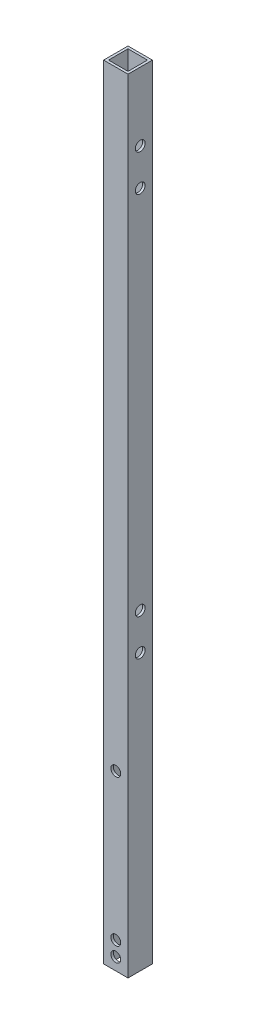
ISO-10303-21;
HEADER;
FILE_DESCRIPTION(('STEP AP214'),'2;1');
FILE_NAME('part.step','',(''),(''),'','','');
FILE_SCHEMA(('AUTOMOTIVE_DESIGN { 1 0 10303 214 1 1 1 1 }'));
ENDSEC;
DATA;
#1=APPLICATION_CONTEXT('core data for automotive mechanical design processes');
#2=APPLICATION_PROTOCOL_DEFINITION('international standard','automotive_design',2000,#1);
#3=PRODUCT_CONTEXT('',#1,'mechanical');
#4=PRODUCT('Part','Part','',(#3));
#5=PRODUCT_RELATED_PRODUCT_CATEGORY('part','',(#4));
#6=PRODUCT_DEFINITION_FORMATION('','',#4);
#7=PRODUCT_DEFINITION_CONTEXT('part definition',#1,'design');
#8=PRODUCT_DEFINITION('design','',#6,#7);
#9=PRODUCT_DEFINITION_SHAPE('','',#8);
#10=(LENGTH_UNIT() NAMED_UNIT(*) SI_UNIT(.MILLI.,.METRE.));
#11=(NAMED_UNIT(*) PLANE_ANGLE_UNIT() SI_UNIT($,.RADIAN.));
#12=(NAMED_UNIT(*) SI_UNIT($,.STERADIAN.) SOLID_ANGLE_UNIT());
#13=UNCERTAINTY_MEASURE_WITH_UNIT(LENGTH_MEASURE(1.E-05),#10,'distance_accuracy_value','');
#14=(GEOMETRIC_REPRESENTATION_CONTEXT(3) GLOBAL_UNCERTAINTY_ASSIGNED_CONTEXT((#13)) GLOBAL_UNIT_ASSIGNED_CONTEXT((#10,
#11,#12)) REPRESENTATION_CONTEXT('',''));
#15=CARTESIAN_POINT('',(0.,0.,0.));
#16=DIRECTION('',(0.,0.,1.));
#17=DIRECTION('',(1.,0.,0.));
#18=AXIS2_PLACEMENT_3D('',#15,#16,#17);
#19=CARTESIAN_POINT('',(0.,340.,0.));
#20=DIRECTION('',(0.,1.,0.));
#21=DIRECTION('',(0.,0.,1.));
#22=AXIS2_PLACEMENT_3D('',#19,#20,#21);
#23=PLANE('',#22);
#24=DIRECTION('',(0.,0.,-1.));
#25=VECTOR('',#24,1.);
#26=CARTESIAN_POINT('',(5.,340.,-5.));
#27=LINE('',#26,#25);
#28=CARTESIAN_POINT('',(5.,340.,5.));
#29=VERTEX_POINT('',#28);
#30=CARTESIAN_POINT('',(5.,340.,-5.));
#31=VERTEX_POINT('',#30);
#32=EDGE_CURVE('E241',#29,#31,#27,.T.);
#33=ORIENTED_EDGE('',*,*,#32,.T.);
#34=DIRECTION('',(-1.,0.,0.));
#35=VECTOR('',#34,1.);
#36=CARTESIAN_POINT('',(-5.,340.,-5.));
#37=LINE('',#36,#35);
#38=CARTESIAN_POINT('',(-5.,340.,-5.));
#39=VERTEX_POINT('',#38);
#40=EDGE_CURVE('E122',#31,#39,#37,.T.);
#41=ORIENTED_EDGE('',*,*,#40,.T.);
#42=DIRECTION('',(0.,0.,1.));
#43=VECTOR('',#42,1.);
#44=CARTESIAN_POINT('',(-5.,340.,-5.));
#45=LINE('',#44,#43);
#46=CARTESIAN_POINT('',(-5.,340.,5.));
#47=VERTEX_POINT('',#46);
#48=EDGE_CURVE('E246',#39,#47,#45,.T.);
#49=ORIENTED_EDGE('',*,*,#48,.T.);
#50=DIRECTION('',(1.,0.,0.));
#51=VECTOR('',#50,1.);
#52=CARTESIAN_POINT('',(-5.,340.,5.));
#53=LINE('',#52,#51);
#54=EDGE_CURVE('E249',#47,#29,#53,.T.);
#55=ORIENTED_EDGE('',*,*,#54,.T.);
#56=EDGE_LOOP('',(#33,#41,#49,#55));
#57=FACE_BOUND('',#56,.T.);
#58=DIRECTION('',(-1.,0.,0.));
#59=VECTOR('',#58,1.);
#60=CARTESIAN_POINT('',(-4.,340.,-4.));
#61=LINE('',#60,#59);
#62=CARTESIAN_POINT('',(4.,340.,-4.));
#63=VERTEX_POINT('',#62);
#64=CARTESIAN_POINT('',(-4.,340.,-4.));
#65=VERTEX_POINT('',#64);
#66=EDGE_CURVE('E215',#63,#65,#61,.T.);
#67=ORIENTED_EDGE('',*,*,#66,.F.);
#68=DIRECTION('',(0.,0.,-1.));
#69=VECTOR('',#68,1.);
#70=CARTESIAN_POINT('',(4.,340.,-4.));
#71=LINE('',#70,#69);
#72=CARTESIAN_POINT('',(4.,340.,4.));
#73=VERTEX_POINT('',#72);
#74=EDGE_CURVE('E212',#73,#63,#71,.T.);
#75=ORIENTED_EDGE('',*,*,#74,.F.);
#76=DIRECTION('',(1.,0.,0.));
#77=VECTOR('',#76,1.);
#78=CARTESIAN_POINT('',(-4.,340.,4.));
#79=LINE('',#78,#77);
#80=CARTESIAN_POINT('',(-4.,340.,4.));
#81=VERTEX_POINT('',#80);
#82=EDGE_CURVE('E222',#81,#73,#79,.T.);
#83=ORIENTED_EDGE('',*,*,#82,.F.);
#84=DIRECTION('',(0.,0.,1.));
#85=VECTOR('',#84,1.);
#86=CARTESIAN_POINT('',(-4.,340.,-4.));
#87=LINE('',#86,#85);
#88=EDGE_CURVE('E218',#65,#81,#87,.T.);
#89=ORIENTED_EDGE('',*,*,#88,.F.);
#90=EDGE_LOOP('',(#67,#75,#83,#89));
#91=FACE_BOUND('',#90,.T.);
#92=ADVANCED_FACE('F39',(#57,#91),#23,.T.);
#93=CARTESIAN_POINT('',(5.,340.,-5.));
#94=DIRECTION('',(-1.,0.,0.));
#95=DIRECTION('',(0.,0.,1.));
#96=AXIS2_PLACEMENT_3D('',#93,#94,#95);
#97=PLANE('',#96);
#98=CARTESIAN_POINT('',(5.,312.,0.));
#99=DIRECTION('',(1.,0.,0.));
#100=DIRECTION('',(0.,0.,-1.));
#101=AXIS2_PLACEMENT_3D('',#98,#99,#100);
#102=CIRCLE('',#101,2.02800000000001);
#103=CARTESIAN_POINT('',(5.,312.,-2.02800000000001));
#104=VERTEX_POINT('',#103);
#105=EDGE_CURVE('E278',#104,#104,#102,.T.);
#106=ORIENTED_EDGE('',*,*,#105,.F.);
#107=EDGE_LOOP('',(#106));
#108=FACE_BOUND('',#107,.T.);
#109=CARTESIAN_POINT('',(5.,297.,0.));
#110=DIRECTION('',(1.,0.,0.));
#111=DIRECTION('',(0.,0.,-1.));
#112=AXIS2_PLACEMENT_3D('',#109,#110,#111);
#113=CIRCLE('',#112,2.02499999999999);
#114=CARTESIAN_POINT('',(5.,297.,-2.025));
#115=VERTEX_POINT('',#114);
#116=EDGE_CURVE('E286',#115,#115,#113,.T.);
#117=ORIENTED_EDGE('',*,*,#116,.F.);
#118=EDGE_LOOP('',(#117));
#119=FACE_BOUND('',#118,.T.);
#120=CARTESIAN_POINT('',(5.,147.,0.));
#121=DIRECTION('',(1.,0.,0.));
#122=DIRECTION('',(0.,0.,-1.));
#123=AXIS2_PLACEMENT_3D('',#120,#121,#122);
#124=CIRCLE('',#123,2.02500000000001);
#125=CARTESIAN_POINT('',(5.,147.,-2.02500000000004));
#126=VERTEX_POINT('',#125);
#127=EDGE_CURVE('E294',#126,#126,#124,.T.);
#128=ORIENTED_EDGE('',*,*,#127,.F.);
#129=EDGE_LOOP('',(#128));
#130=FACE_BOUND('',#129,.T.);
#131=CARTESIAN_POINT('',(5.,132.,0.));
#132=DIRECTION('',(1.,0.,0.));
#133=DIRECTION('',(0.,0.,-1.));
#134=AXIS2_PLACEMENT_3D('',#131,#132,#133);
#135=CIRCLE('',#134,2.02500000000001);
#136=CARTESIAN_POINT('',(5.,132.,-2.02500000000003));
#137=VERTEX_POINT('',#136);
#138=EDGE_CURVE('E274',#137,#137,#135,.T.);
#139=ORIENTED_EDGE('',*,*,#138,.F.);
#140=EDGE_LOOP('',(#139));
#141=FACE_BOUND('',#140,.T.);
#142=DIRECTION('',(0.,-1.,0.));
#143=VECTOR('',#142,1.);
#144=CARTESIAN_POINT('',(5.,340.,5.));
#145=LINE('',#144,#143);
#146=CARTESIAN_POINT('',(5.,19.,5.));
#147=VERTEX_POINT('',#146);
#148=EDGE_CURVE('E118',#29,#147,#145,.T.);
#149=ORIENTED_EDGE('',*,*,#148,.T.);
#150=DIRECTION('',(0.,0.,1.));
#151=VECTOR('',#150,1.);
#152=CARTESIAN_POINT('',(5.,19.,-5.));
#153=LINE('',#152,#151);
#154=CARTESIAN_POINT('',(5.,19.,-5.));
#155=VERTEX_POINT('',#154);
#156=EDGE_CURVE('E55',#155,#147,#153,.T.);
#157=ORIENTED_EDGE('',*,*,#156,.F.);
#158=DIRECTION('',(0.,-1.,0.));
#159=VECTOR('',#158,1.);
#160=CARTESIAN_POINT('',(5.,340.,-5.));
#161=LINE('',#160,#159);
#162=EDGE_CURVE('E48',#31,#155,#161,.T.);
#163=ORIENTED_EDGE('',*,*,#162,.F.);
#164=ORIENTED_EDGE('',*,*,#32,.F.);
#165=EDGE_LOOP('',(#149,#157,#163,#164));
#166=FACE_BOUND('',#165,.T.);
#167=ADVANCED_FACE('F41',(#108,#119,#130,#141,#166),#97,.F.);
#168=CARTESIAN_POINT('',(-5.,340.,-5.));
#169=DIRECTION('',(0.,0.,1.));
#170=DIRECTION('',(1.,0.,0.));
#171=AXIS2_PLACEMENT_3D('',#168,#169,#170);
#172=PLANE('',#171);
#173=CARTESIAN_POINT('',(0.,90.,-5.));
#174=DIRECTION('',(0.,0.,1.));
#175=DIRECTION('',(1.,0.,0.));
#176=AXIS2_PLACEMENT_3D('',#173,#174,#175);
#177=CIRCLE('',#176,2.025);
#178=CARTESIAN_POINT('',(2.025,90.,-5.));
#179=VERTEX_POINT('',#178);
#180=EDGE_CURVE('E137',#179,#179,#177,.T.);
#181=ORIENTED_EDGE('',*,*,#180,.T.);
#182=EDGE_LOOP('',(#181));
#183=FACE_BOUND('',#182,.T.);
#184=CARTESIAN_POINT('',(0.,30.,-5.));
#185=DIRECTION('',(0.,0.,1.));
#186=DIRECTION('',(1.,0.,0.));
#187=AXIS2_PLACEMENT_3D('',#184,#185,#186);
#188=CIRCLE('',#187,2.025);
#189=CARTESIAN_POINT('',(2.025,30.,-5.));
#190=VERTEX_POINT('',#189);
#191=EDGE_CURVE('E188',#190,#190,#188,.T.);
#192=ORIENTED_EDGE('',*,*,#191,.T.);
#193=EDGE_LOOP('',(#192));
#194=FACE_BOUND('',#193,.T.);
#195=CARTESIAN_POINT('',(0.,24.,-5.));
#196=DIRECTION('',(0.,0.,1.));
#197=DIRECTION('',(1.,0.,0.));
#198=AXIS2_PLACEMENT_3D('',#195,#196,#197);
#199=CIRCLE('',#198,2.025);
#200=CARTESIAN_POINT('',(2.02500000000006,24.,-5.));
#201=VERTEX_POINT('',#200);
#202=EDGE_CURVE('E196',#201,#201,#199,.T.);
#203=ORIENTED_EDGE('',*,*,#202,.T.);
#204=EDGE_LOOP('',(#203));
#205=FACE_BOUND('',#204,.T.);
#206=ORIENTED_EDGE('',*,*,#162,.T.);
#207=DIRECTION('',(-1.,0.,0.));
#208=VECTOR('',#207,1.);
#209=CARTESIAN_POINT('',(-5.,19.,-5.));
#210=LINE('',#209,#208);
#211=CARTESIAN_POINT('',(-5.,19.,-5.));
#212=VERTEX_POINT('',#211);
#213=EDGE_CURVE('E102',#155,#212,#210,.T.);
#214=ORIENTED_EDGE('',*,*,#213,.T.);
#215=DIRECTION('',(0.,-1.,0.));
#216=VECTOR('',#215,1.);
#217=CARTESIAN_POINT('',(-5.,340.,-5.));
#218=LINE('',#217,#216);
#219=EDGE_CURVE('E125',#39,#212,#218,.T.);
#220=ORIENTED_EDGE('',*,*,#219,.F.);
#221=ORIENTED_EDGE('',*,*,#40,.F.);
#222=EDGE_LOOP('',(#206,#214,#220,#221));
#223=FACE_BOUND('',#222,.T.);
#224=ADVANCED_FACE('F121',(#183,#194,#205,#223),#172,.F.);
#225=CARTESIAN_POINT('',(-5.,340.,-5.));
#226=DIRECTION('',(1.,0.,0.));
#227=DIRECTION('',(0.,0.,-1.));
#228=AXIS2_PLACEMENT_3D('',#225,#226,#227);
#229=PLANE('',#228);
#230=CARTESIAN_POINT('',(-5.,312.,0.));
#231=DIRECTION('',(1.,0.,0.));
#232=DIRECTION('',(0.,0.,-1.));
#233=AXIS2_PLACEMENT_3D('',#230,#231,#232);
#234=CIRCLE('',#233,2.02800000000001);
#235=CARTESIAN_POINT('',(-5.,312.,-2.02800000000001));
#236=VERTEX_POINT('',#235);
#237=EDGE_CURVE('E153',#236,#236,#234,.T.);
#238=ORIENTED_EDGE('',*,*,#237,.T.);
#239=EDGE_LOOP('',(#238));
#240=FACE_BOUND('',#239,.T.);
#241=CARTESIAN_POINT('',(-5.,297.,0.));
#242=DIRECTION('',(1.,0.,0.));
#243=DIRECTION('',(0.,0.,-1.));
#244=AXIS2_PLACEMENT_3D('',#241,#242,#243);
#245=CIRCLE('',#244,2.02499999999999);
#246=CARTESIAN_POINT('',(-5.,297.,-2.025));
#247=VERTEX_POINT('',#246);
#248=EDGE_CURVE('E282',#247,#247,#245,.T.);
#249=ORIENTED_EDGE('',*,*,#248,.T.);
#250=EDGE_LOOP('',(#249));
#251=FACE_BOUND('',#250,.T.);
#252=CARTESIAN_POINT('',(-5.,147.,0.));
#253=DIRECTION('',(1.,0.,0.));
#254=DIRECTION('',(0.,0.,-1.));
#255=AXIS2_PLACEMENT_3D('',#252,#253,#254);
#256=CIRCLE('',#255,2.02500000000001);
#257=CARTESIAN_POINT('',(-5.,147.,-2.02500000000004));
#258=VERTEX_POINT('',#257);
#259=EDGE_CURVE('E290',#258,#258,#256,.T.);
#260=ORIENTED_EDGE('',*,*,#259,.T.);
#261=EDGE_LOOP('',(#260));
#262=FACE_BOUND('',#261,.T.);
#263=CARTESIAN_POINT('',(-5.,132.,0.));
#264=DIRECTION('',(1.,0.,0.));
#265=DIRECTION('',(0.,0.,-1.));
#266=AXIS2_PLACEMENT_3D('',#263,#264,#265);
#267=CIRCLE('',#266,2.02500000000001);
#268=CARTESIAN_POINT('',(-5.,132.,-2.02500000000003));
#269=VERTEX_POINT('',#268);
#270=EDGE_CURVE('E298',#269,#269,#267,.T.);
#271=ORIENTED_EDGE('',*,*,#270,.T.);
#272=EDGE_LOOP('',(#271));
#273=FACE_BOUND('',#272,.T.);
#274=ORIENTED_EDGE('',*,*,#219,.T.);
#275=DIRECTION('',(0.,0.,1.));
#276=VECTOR('',#275,1.);
#277=CARTESIAN_POINT('',(-5.,19.,-5.));
#278=LINE('',#277,#276);
#279=CARTESIAN_POINT('',(-5.,19.,5.));
#280=VERTEX_POINT('',#279);
#281=EDGE_CURVE('E105',#212,#280,#278,.T.);
#282=ORIENTED_EDGE('',*,*,#281,.T.);
#283=DIRECTION('',(0.,-1.,0.));
#284=VECTOR('',#283,1.);
#285=CARTESIAN_POINT('',(-5.,340.,5.));
#286=LINE('',#285,#284);
#287=EDGE_CURVE('E128',#47,#280,#286,.T.);
#288=ORIENTED_EDGE('',*,*,#287,.F.);
#289=ORIENTED_EDGE('',*,*,#48,.F.);
#290=EDGE_LOOP('',(#274,#282,#288,#289));
#291=FACE_BOUND('',#290,.T.);
#292=ADVANCED_FACE('F261',(#240,#251,#262,#273,#291),#229,.F.);
#293=CARTESIAN_POINT('',(-5.,340.,5.));
#294=DIRECTION('',(0.,0.,-1.));
#295=DIRECTION('',(-1.,0.,0.));
#296=AXIS2_PLACEMENT_3D('',#293,#294,#295);
#297=PLANE('',#296);
#298=CARTESIAN_POINT('',(0.,90.,5.));
#299=DIRECTION('',(0.,0.,1.));
#300=DIRECTION('',(1.,0.,0.));
#301=AXIS2_PLACEMENT_3D('',#298,#299,#300);
#302=CIRCLE('',#301,2.025);
#303=CARTESIAN_POINT('',(2.025,90.,5.));
#304=VERTEX_POINT('',#303);
#305=EDGE_CURVE('E184',#304,#304,#302,.T.);
#306=ORIENTED_EDGE('',*,*,#305,.F.);
#307=EDGE_LOOP('',(#306));
#308=FACE_BOUND('',#307,.T.);
#309=CARTESIAN_POINT('',(0.,30.,5.));
#310=DIRECTION('',(0.,0.,1.));
#311=DIRECTION('',(1.,0.,0.));
#312=AXIS2_PLACEMENT_3D('',#309,#310,#311);
#313=CIRCLE('',#312,2.025);
#314=CARTESIAN_POINT('',(2.025,30.,5.));
#315=VERTEX_POINT('',#314);
#316=EDGE_CURVE('E192',#315,#315,#313,.T.);
#317=ORIENTED_EDGE('',*,*,#316,.F.);
#318=EDGE_LOOP('',(#317));
#319=FACE_BOUND('',#318,.T.);
#320=CARTESIAN_POINT('',(0.,24.,5.));
#321=DIRECTION('',(0.,0.,1.));
#322=DIRECTION('',(1.,0.,0.));
#323=AXIS2_PLACEMENT_3D('',#320,#321,#322);
#324=CIRCLE('',#323,2.025);
#325=CARTESIAN_POINT('',(2.02500000000006,24.,5.));
#326=VERTEX_POINT('',#325);
#327=EDGE_CURVE('E172',#326,#326,#324,.T.);
#328=ORIENTED_EDGE('',*,*,#327,.F.);
#329=EDGE_LOOP('',(#328));
#330=FACE_BOUND('',#329,.T.);
#331=ORIENTED_EDGE('',*,*,#287,.T.);
#332=DIRECTION('',(-1.,0.,0.));
#333=VECTOR('',#332,1.);
#334=CARTESIAN_POINT('',(-5.,19.,5.));
#335=LINE('',#334,#333);
#336=EDGE_CURVE('E111',#147,#280,#335,.T.);
#337=ORIENTED_EDGE('',*,*,#336,.F.);
#338=ORIENTED_EDGE('',*,*,#148,.F.);
#339=ORIENTED_EDGE('',*,*,#54,.F.);
#340=EDGE_LOOP('',(#331,#337,#338,#339));
#341=FACE_BOUND('',#340,.T.);
#342=ADVANCED_FACE('F258',(#308,#319,#330,#341),#297,.F.);
#343=CARTESIAN_POINT('',(4.,340.,-4.));
#344=DIRECTION('',(-1.,0.,0.));
#345=DIRECTION('',(0.,0.,1.));
#346=AXIS2_PLACEMENT_3D('',#343,#344,#345);
#347=PLANE('',#346);
#348=DIRECTION('',(0.,0.,-1.));
#349=VECTOR('',#348,1.);
#350=CARTESIAN_POINT('',(4.,19.,-4.));
#351=LINE('',#350,#349);
#352=CARTESIAN_POINT('',(4.,19.,4.));
#353=VERTEX_POINT('',#352);
#354=CARTESIAN_POINT('',(4.,19.,-4.));
#355=VERTEX_POINT('',#354);
#356=EDGE_CURVE('E271',#353,#355,#351,.T.);
#357=ORIENTED_EDGE('',*,*,#356,.F.);
#358=DIRECTION('',(0.,-1.,0.));
#359=VECTOR('',#358,1.);
#360=CARTESIAN_POINT('',(4.,340.,4.));
#361=LINE('',#360,#359);
#362=EDGE_CURVE('E225',#73,#353,#361,.T.);
#363=ORIENTED_EDGE('',*,*,#362,.F.);
#364=ORIENTED_EDGE('',*,*,#74,.T.);
#365=DIRECTION('',(0.,-1.,0.));
#366=VECTOR('',#365,1.);
#367=CARTESIAN_POINT('',(4.,340.,-4.));
#368=LINE('',#367,#366);
#369=EDGE_CURVE('E237',#63,#355,#368,.T.);
#370=ORIENTED_EDGE('',*,*,#369,.T.);
#371=EDGE_LOOP('',(#357,#363,#364,#370));
#372=FACE_BOUND('',#371,.T.);
#373=CARTESIAN_POINT('',(4.,312.,0.));
#374=DIRECTION('',(-1.,0.,0.));
#375=DIRECTION('',(0.,0.,1.));
#376=AXIS2_PLACEMENT_3D('',#373,#374,#375);
#377=CIRCLE('',#376,2.02800000000001);
#378=CARTESIAN_POINT('',(4.,312.,2.02800000000001));
#379=VERTEX_POINT('',#378);
#380=EDGE_CURVE('E166',#379,#379,#377,.T.);
#381=ORIENTED_EDGE('',*,*,#380,.F.);
#382=EDGE_LOOP('',(#381));
#383=FACE_BOUND('',#382,.T.);
#384=CARTESIAN_POINT('',(4.,297.,0.));
#385=DIRECTION('',(-1.,0.,0.));
#386=DIRECTION('',(0.,0.,1.));
#387=AXIS2_PLACEMENT_3D('',#384,#385,#386);
#388=CIRCLE('',#387,2.02499999999999);
#389=CARTESIAN_POINT('',(4.,297.,2.02499999999999));
#390=VERTEX_POINT('',#389);
#391=EDGE_CURVE('E162',#390,#390,#388,.T.);
#392=ORIENTED_EDGE('',*,*,#391,.F.);
#393=EDGE_LOOP('',(#392));
#394=FACE_BOUND('',#393,.T.);
#395=CARTESIAN_POINT('',(4.,147.,0.));
#396=DIRECTION('',(-1.,0.,0.));
#397=DIRECTION('',(0.,0.,1.));
#398=AXIS2_PLACEMENT_3D('',#395,#396,#397);
#399=CIRCLE('',#398,2.02500000000001);
#400=CARTESIAN_POINT('',(4.,147.,2.02499999999999));
#401=VERTEX_POINT('',#400);
#402=EDGE_CURVE('E158',#401,#401,#399,.T.);
#403=ORIENTED_EDGE('',*,*,#402,.F.);
#404=EDGE_LOOP('',(#403));
#405=FACE_BOUND('',#404,.T.);
#406=CARTESIAN_POINT('',(4.,132.,0.));
#407=DIRECTION('',(-1.,0.,0.));
#408=DIRECTION('',(0.,0.,1.));
#409=AXIS2_PLACEMENT_3D('',#406,#407,#408);
#410=CIRCLE('',#409,2.02500000000001);
#411=CARTESIAN_POINT('',(4.,132.,2.02499999999999));
#412=VERTEX_POINT('',#411);
#413=EDGE_CURVE('E152',#412,#412,#410,.T.);
#414=ORIENTED_EDGE('',*,*,#413,.F.);
#415=EDGE_LOOP('',(#414));
#416=FACE_BOUND('',#415,.T.);
#417=ADVANCED_FACE('F311',(#372,#383,#394,#405,#416),#347,.T.);
#418=CARTESIAN_POINT('',(-4.,340.,-4.));
#419=DIRECTION('',(0.,0.,1.));
#420=DIRECTION('',(1.,0.,0.));
#421=AXIS2_PLACEMENT_3D('',#418,#419,#420);
#422=PLANE('',#421);
#423=DIRECTION('',(-1.,0.,0.));
#424=VECTOR('',#423,1.);
#425=CARTESIAN_POINT('',(-4.,19.,-4.));
#426=LINE('',#425,#424);
#427=CARTESIAN_POINT('',(-4.,19.,-4.));
#428=VERTEX_POINT('',#427);
#429=EDGE_CURVE('E265',#355,#428,#426,.T.);
#430=ORIENTED_EDGE('',*,*,#429,.F.);
#431=ORIENTED_EDGE('',*,*,#369,.F.);
#432=ORIENTED_EDGE('',*,*,#66,.T.);
#433=DIRECTION('',(0.,-1.,0.));
#434=VECTOR('',#433,1.);
#435=CARTESIAN_POINT('',(-4.,340.,-4.));
#436=LINE('',#435,#434);
#437=EDGE_CURVE('E233',#65,#428,#436,.T.);
#438=ORIENTED_EDGE('',*,*,#437,.T.);
#439=EDGE_LOOP('',(#430,#431,#432,#438));
#440=FACE_BOUND('',#439,.T.);
#441=CARTESIAN_POINT('',(0.,90.,-4.));
#442=DIRECTION('',(0.,0.,1.));
#443=DIRECTION('',(1.,0.,0.));
#444=AXIS2_PLACEMENT_3D('',#441,#442,#443);
#445=CIRCLE('',#444,2.025);
#446=CARTESIAN_POINT('',(2.025,90.,-4.));
#447=VERTEX_POINT('',#446);
#448=EDGE_CURVE('E147',#447,#447,#445,.T.);
#449=ORIENTED_EDGE('',*,*,#448,.F.);
#450=EDGE_LOOP('',(#449));
#451=FACE_BOUND('',#450,.T.);
#452=CARTESIAN_POINT('',(0.,30.,-4.));
#453=DIRECTION('',(0.,0.,1.));
#454=DIRECTION('',(1.,0.,0.));
#455=AXIS2_PLACEMENT_3D('',#452,#453,#454);
#456=CIRCLE('',#455,2.025);
#457=CARTESIAN_POINT('',(2.025,30.,-4.));
#458=VERTEX_POINT('',#457);
#459=EDGE_CURVE('E142',#458,#458,#456,.T.);
#460=ORIENTED_EDGE('',*,*,#459,.F.);
#461=EDGE_LOOP('',(#460));
#462=FACE_BOUND('',#461,.T.);
#463=CARTESIAN_POINT('',(0.,24.,-4.));
#464=DIRECTION('',(0.,0.,1.));
#465=DIRECTION('',(1.,0.,0.));
#466=AXIS2_PLACEMENT_3D('',#463,#464,#465);
#467=CIRCLE('',#466,2.025);
#468=CARTESIAN_POINT('',(2.02500000000006,24.,-4.));
#469=VERTEX_POINT('',#468);
#470=EDGE_CURVE('E136',#469,#469,#467,.T.);
#471=ORIENTED_EDGE('',*,*,#470,.F.);
#472=EDGE_LOOP('',(#471));
#473=FACE_BOUND('',#472,.T.);
#474=ADVANCED_FACE('F313',(#440,#451,#462,#473),#422,.T.);
#475=CARTESIAN_POINT('',(-4.,340.,-4.));
#476=DIRECTION('',(1.,0.,0.));
#477=DIRECTION('',(0.,0.,-1.));
#478=AXIS2_PLACEMENT_3D('',#475,#476,#477);
#479=PLANE('',#478);
#480=DIRECTION('',(0.,0.,1.));
#481=VECTOR('',#480,1.);
#482=CARTESIAN_POINT('',(-4.,19.,-4.));
#483=LINE('',#482,#481);
#484=CARTESIAN_POINT('',(-4.,19.,4.));
#485=VERTEX_POINT('',#484);
#486=EDGE_CURVE('E62',#428,#485,#483,.T.);
#487=ORIENTED_EDGE('',*,*,#486,.F.);
#488=ORIENTED_EDGE('',*,*,#437,.F.);
#489=ORIENTED_EDGE('',*,*,#88,.T.);
#490=DIRECTION('',(0.,-1.,0.));
#491=VECTOR('',#490,1.);
#492=CARTESIAN_POINT('',(-4.,340.,4.));
#493=LINE('',#492,#491);
#494=EDGE_CURVE('E229',#81,#485,#493,.T.);
#495=ORIENTED_EDGE('',*,*,#494,.T.);
#496=EDGE_LOOP('',(#487,#488,#489,#495));
#497=FACE_BOUND('',#496,.T.);
#498=CARTESIAN_POINT('',(-4.,312.,0.));
#499=DIRECTION('',(1.,0.,0.));
#500=DIRECTION('',(0.,0.,-1.));
#501=AXIS2_PLACEMENT_3D('',#498,#499,#500);
#502=CIRCLE('',#501,2.02800000000001);
#503=CARTESIAN_POINT('',(-4.,312.,-2.02800000000001));
#504=VERTEX_POINT('',#503);
#505=EDGE_CURVE('E163',#504,#504,#502,.T.);
#506=ORIENTED_EDGE('',*,*,#505,.F.);
#507=EDGE_LOOP('',(#506));
#508=FACE_BOUND('',#507,.T.);
#509=CARTESIAN_POINT('',(-4.,297.,0.));
#510=DIRECTION('',(1.,0.,0.));
#511=DIRECTION('',(0.,0.,-1.));
#512=AXIS2_PLACEMENT_3D('',#509,#510,#511);
#513=CIRCLE('',#512,2.02499999999999);
#514=CARTESIAN_POINT('',(-4.,297.,-2.025));
#515=VERTEX_POINT('',#514);
#516=EDGE_CURVE('E159',#515,#515,#513,.T.);
#517=ORIENTED_EDGE('',*,*,#516,.F.);
#518=EDGE_LOOP('',(#517));
#519=FACE_BOUND('',#518,.T.);
#520=CARTESIAN_POINT('',(-4.,147.,0.));
#521=DIRECTION('',(1.,0.,0.));
#522=DIRECTION('',(0.,0.,-1.));
#523=AXIS2_PLACEMENT_3D('',#520,#521,#522);
#524=CIRCLE('',#523,2.02500000000001);
#525=CARTESIAN_POINT('',(-4.,147.,-2.02500000000004));
#526=VERTEX_POINT('',#525);
#527=EDGE_CURVE('E154',#526,#526,#524,.T.);
#528=ORIENTED_EDGE('',*,*,#527,.F.);
#529=EDGE_LOOP('',(#528));
#530=FACE_BOUND('',#529,.T.);
#531=CARTESIAN_POINT('',(-4.,132.,0.));
#532=DIRECTION('',(1.,0.,0.));
#533=DIRECTION('',(0.,0.,-1.));
#534=AXIS2_PLACEMENT_3D('',#531,#532,#533);
#535=CIRCLE('',#534,2.02500000000001);
#536=CARTESIAN_POINT('',(-4.,132.,-2.02500000000003));
#537=VERTEX_POINT('',#536);
#538=EDGE_CURVE('E148',#537,#537,#535,.T.);
#539=ORIENTED_EDGE('',*,*,#538,.F.);
#540=EDGE_LOOP('',(#539));
#541=FACE_BOUND('',#540,.T.);
#542=ADVANCED_FACE('F320',(#497,#508,#519,#530,#541),#479,.T.);
#543=CARTESIAN_POINT('',(-4.,340.,4.));
#544=DIRECTION('',(0.,0.,-1.));
#545=DIRECTION('',(-1.,0.,0.));
#546=AXIS2_PLACEMENT_3D('',#543,#544,#545);
#547=PLANE('',#546);
#548=DIRECTION('',(1.,0.,0.));
#549=VECTOR('',#548,1.);
#550=CARTESIAN_POINT('',(-4.,19.,4.));
#551=LINE('',#550,#549);
#552=EDGE_CURVE('E11',#485,#353,#551,.T.);
#553=ORIENTED_EDGE('',*,*,#552,.F.);
#554=ORIENTED_EDGE('',*,*,#494,.F.);
#555=ORIENTED_EDGE('',*,*,#82,.T.);
#556=ORIENTED_EDGE('',*,*,#362,.T.);
#557=EDGE_LOOP('',(#553,#554,#555,#556));
#558=FACE_BOUND('',#557,.T.);
#559=CARTESIAN_POINT('',(0.,90.,4.));
#560=DIRECTION('',(0.,0.,-1.));
#561=DIRECTION('',(-1.,0.,0.));
#562=AXIS2_PLACEMENT_3D('',#559,#560,#561);
#563=CIRCLE('',#562,2.025);
#564=CARTESIAN_POINT('',(-2.025,90.,4.));
#565=VERTEX_POINT('',#564);
#566=EDGE_CURVE('E143',#565,#565,#563,.T.);
#567=ORIENTED_EDGE('',*,*,#566,.F.);
#568=EDGE_LOOP('',(#567));
#569=FACE_BOUND('',#568,.T.);
#570=CARTESIAN_POINT('',(0.,30.,4.));
#571=DIRECTION('',(0.,0.,-1.));
#572=DIRECTION('',(-1.,0.,0.));
#573=AXIS2_PLACEMENT_3D('',#570,#571,#572);
#574=CIRCLE('',#573,2.025);
#575=CARTESIAN_POINT('',(-2.025,30.,4.));
#576=VERTEX_POINT('',#575);
#577=EDGE_CURVE('E138',#576,#576,#574,.T.);
#578=ORIENTED_EDGE('',*,*,#577,.F.);
#579=EDGE_LOOP('',(#578));
#580=FACE_BOUND('',#579,.T.);
#581=CARTESIAN_POINT('',(0.,24.,4.));
#582=DIRECTION('',(0.,0.,-1.));
#583=DIRECTION('',(-1.,0.,0.));
#584=AXIS2_PLACEMENT_3D('',#581,#582,#583);
#585=CIRCLE('',#584,2.025);
#586=CARTESIAN_POINT('',(-2.02499999999994,24.,4.));
#587=VERTEX_POINT('',#586);
#588=EDGE_CURVE('E132',#587,#587,#585,.T.);
#589=ORIENTED_EDGE('',*,*,#588,.F.);
#590=EDGE_LOOP('',(#589));
#591=FACE_BOUND('',#590,.T.);
#592=ADVANCED_FACE('F367',(#558,#569,#580,#591),#547,.T.);
#593=CARTESIAN_POINT('',(0.,24.,-5.));
#594=DIRECTION('',(0.,0.,1.));
#595=DIRECTION('',(1.,0.,0.));
#596=AXIS2_PLACEMENT_3D('',#593,#594,#595);
#597=CYLINDRICAL_SURFACE('',#596,2.025);
#598=ORIENTED_EDGE('',*,*,#588,.T.);
#599=EDGE_LOOP('',(#598));
#600=FACE_BOUND('',#599,.T.);
#601=ORIENTED_EDGE('',*,*,#327,.T.);
#602=EDGE_LOOP('',(#601));
#603=FACE_BOUND('',#602,.T.);
#604=ADVANCED_FACE('F354',(#600,#603),#597,.F.);
#605=CARTESIAN_POINT('',(0.,30.,-5.));
#606=DIRECTION('',(0.,0.,1.));
#607=DIRECTION('',(1.,0.,0.));
#608=AXIS2_PLACEMENT_3D('',#605,#606,#607);
#609=CYLINDRICAL_SURFACE('',#608,2.025);
#610=ORIENTED_EDGE('',*,*,#577,.T.);
#611=EDGE_LOOP('',(#610));
#612=FACE_BOUND('',#611,.T.);
#613=ORIENTED_EDGE('',*,*,#316,.T.);
#614=EDGE_LOOP('',(#613));
#615=FACE_BOUND('',#614,.T.);
#616=ADVANCED_FACE('F362',(#612,#615),#609,.F.);
#617=CARTESIAN_POINT('',(0.,90.,-5.));
#618=DIRECTION('',(0.,0.,1.));
#619=DIRECTION('',(1.,0.,0.));
#620=AXIS2_PLACEMENT_3D('',#617,#618,#619);
#621=CYLINDRICAL_SURFACE('',#620,2.025);
#622=ORIENTED_EDGE('',*,*,#566,.T.);
#623=EDGE_LOOP('',(#622));
#624=FACE_BOUND('',#623,.T.);
#625=ORIENTED_EDGE('',*,*,#305,.T.);
#626=EDGE_LOOP('',(#625));
#627=FACE_BOUND('',#626,.T.);
#628=ADVANCED_FACE('F351',(#624,#627),#621,.F.);
#629=ORIENTED_EDGE('',*,*,#470,.T.);
#630=EDGE_LOOP('',(#629));
#631=FACE_BOUND('',#630,.T.);
#632=ORIENTED_EDGE('',*,*,#202,.F.);
#633=EDGE_LOOP('',(#632));
#634=FACE_BOUND('',#633,.T.);
#635=ADVANCED_FACE('F348',(#631,#634),#597,.F.);
#636=ORIENTED_EDGE('',*,*,#459,.T.);
#637=EDGE_LOOP('',(#636));
#638=FACE_BOUND('',#637,.T.);
#639=ORIENTED_EDGE('',*,*,#191,.F.);
#640=EDGE_LOOP('',(#639));
#641=FACE_BOUND('',#640,.T.);
#642=ADVANCED_FACE('F350',(#638,#641),#609,.F.);
#643=ORIENTED_EDGE('',*,*,#448,.T.);
#644=EDGE_LOOP('',(#643));
#645=FACE_BOUND('',#644,.T.);
#646=ORIENTED_EDGE('',*,*,#180,.F.);
#647=EDGE_LOOP('',(#646));
#648=FACE_BOUND('',#647,.T.);
#649=ADVANCED_FACE('F359',(#645,#648),#621,.F.);
#650=CARTESIAN_POINT('',(-5.,132.,0.));
#651=DIRECTION('',(1.,0.,0.));
#652=DIRECTION('',(0.,0.,-1.));
#653=AXIS2_PLACEMENT_3D('',#650,#651,#652);
#654=CYLINDRICAL_SURFACE('',#653,2.02500000000001);
#655=ORIENTED_EDGE('',*,*,#538,.T.);
#656=EDGE_LOOP('',(#655));
#657=FACE_BOUND('',#656,.T.);
#658=ORIENTED_EDGE('',*,*,#270,.F.);
#659=EDGE_LOOP('',(#658));
#660=FACE_BOUND('',#659,.T.);
#661=ADVANCED_FACE('F413',(#657,#660),#654,.F.);
#662=CARTESIAN_POINT('',(-5.,147.,0.));
#663=DIRECTION('',(1.,0.,0.));
#664=DIRECTION('',(0.,0.,-1.));
#665=AXIS2_PLACEMENT_3D('',#662,#663,#664);
#666=CYLINDRICAL_SURFACE('',#665,2.02500000000001);
#667=ORIENTED_EDGE('',*,*,#527,.T.);
#668=EDGE_LOOP('',(#667));
#669=FACE_BOUND('',#668,.T.);
#670=ORIENTED_EDGE('',*,*,#259,.F.);
#671=EDGE_LOOP('',(#670));
#672=FACE_BOUND('',#671,.T.);
#673=ADVANCED_FACE('F417',(#669,#672),#666,.F.);
#674=CARTESIAN_POINT('',(-5.,297.,0.));
#675=DIRECTION('',(1.,0.,0.));
#676=DIRECTION('',(0.,0.,-1.));
#677=AXIS2_PLACEMENT_3D('',#674,#675,#676);
#678=CYLINDRICAL_SURFACE('',#677,2.02499999999999);
#679=ORIENTED_EDGE('',*,*,#516,.T.);
#680=EDGE_LOOP('',(#679));
#681=FACE_BOUND('',#680,.T.);
#682=ORIENTED_EDGE('',*,*,#248,.F.);
#683=EDGE_LOOP('',(#682));
#684=FACE_BOUND('',#683,.T.);
#685=ADVANCED_FACE('F423',(#681,#684),#678,.F.);
#686=CARTESIAN_POINT('',(-5.,312.,0.));
#687=DIRECTION('',(1.,0.,0.));
#688=DIRECTION('',(0.,0.,-1.));
#689=AXIS2_PLACEMENT_3D('',#686,#687,#688);
#690=CYLINDRICAL_SURFACE('',#689,2.02800000000001);
#691=ORIENTED_EDGE('',*,*,#505,.T.);
#692=EDGE_LOOP('',(#691));
#693=FACE_BOUND('',#692,.T.);
#694=ORIENTED_EDGE('',*,*,#237,.F.);
#695=EDGE_LOOP('',(#694));
#696=FACE_BOUND('',#695,.T.);
#697=ADVANCED_FACE('F428',(#693,#696),#690,.F.);
#698=ORIENTED_EDGE('',*,*,#413,.T.);
#699=EDGE_LOOP('',(#698));
#700=FACE_BOUND('',#699,.T.);
#701=ORIENTED_EDGE('',*,*,#138,.T.);
#702=EDGE_LOOP('',(#701));
#703=FACE_BOUND('',#702,.T.);
#704=ADVANCED_FACE('F308',(#700,#703),#654,.F.);
#705=ORIENTED_EDGE('',*,*,#402,.T.);
#706=EDGE_LOOP('',(#705));
#707=FACE_BOUND('',#706,.T.);
#708=ORIENTED_EDGE('',*,*,#127,.T.);
#709=EDGE_LOOP('',(#708));
#710=FACE_BOUND('',#709,.T.);
#711=ADVANCED_FACE('F425',(#707,#710),#666,.F.);
#712=ORIENTED_EDGE('',*,*,#391,.T.);
#713=EDGE_LOOP('',(#712));
#714=FACE_BOUND('',#713,.T.);
#715=ORIENTED_EDGE('',*,*,#116,.T.);
#716=EDGE_LOOP('',(#715));
#717=FACE_BOUND('',#716,.T.);
#718=ADVANCED_FACE('F430',(#714,#717),#678,.F.);
#719=ORIENTED_EDGE('',*,*,#380,.T.);
#720=EDGE_LOOP('',(#719));
#721=FACE_BOUND('',#720,.T.);
#722=ORIENTED_EDGE('',*,*,#105,.T.);
#723=EDGE_LOOP('',(#722));
#724=FACE_BOUND('',#723,.T.);
#725=ADVANCED_FACE('F433',(#721,#724),#690,.F.);
#726=CARTESIAN_POINT('',(-5.,19.,-5.));
#727=DIRECTION('',(0.,1.,0.));
#728=DIRECTION('',(0.,0.,1.));
#729=AXIS2_PLACEMENT_3D('',#726,#727,#728);
#730=PLANE('',#729);
#731=ORIENTED_EDGE('',*,*,#356,.T.);
#732=ORIENTED_EDGE('',*,*,#429,.T.);
#733=ORIENTED_EDGE('',*,*,#486,.T.);
#734=ORIENTED_EDGE('',*,*,#552,.T.);
#735=EDGE_LOOP('',(#731,#732,#733,#734));
#736=FACE_BOUND('',#735,.T.);
#737=ORIENTED_EDGE('',*,*,#336,.T.);
#738=ORIENTED_EDGE('',*,*,#281,.F.);
#739=ORIENTED_EDGE('',*,*,#213,.F.);
#740=ORIENTED_EDGE('',*,*,#156,.T.);
#741=EDGE_LOOP('',(#737,#738,#739,#740));
#742=FACE_BOUND('',#741,.T.);
#743=ADVANCED_FACE('F103',(#736,#742),#730,.F.);
#744=CLOSED_SHELL('',(#92,#167,#224,#292,#342,#417,#474,#542,#592,#604,#616,#628,#635,#642,#649,
#661,#673,#685,#697,#704,#711,#718,#725,#743));
#745=MANIFOLD_SOLID_BREP('B2',#744);
#746=ADVANCED_BREP_SHAPE_REPRESENTATION('',(#18,#745),#14);
#747=SHAPE_DEFINITION_REPRESENTATION(#9,#746);
ENDSEC;
END-ISO-10303-21;
